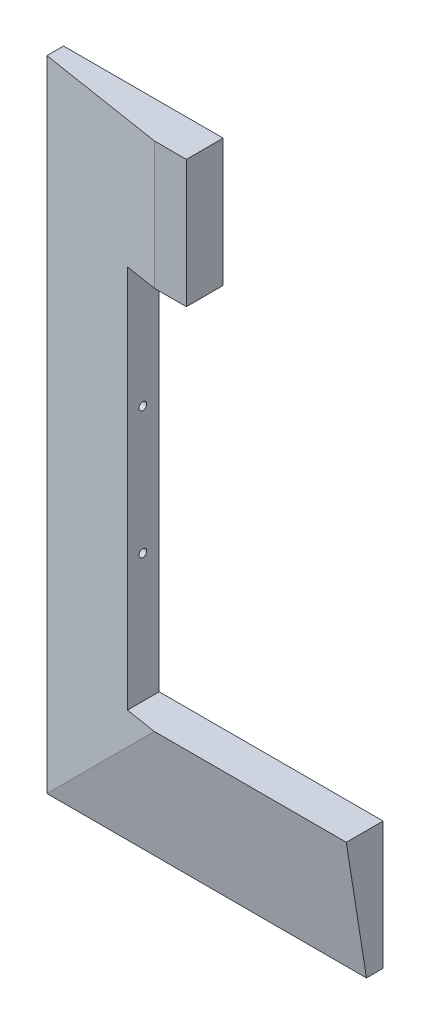
ISO-10303-21;
HEADER;
FILE_DESCRIPTION(('STEP AP214'),'2;1');
FILE_NAME('part.step','',(''),(''),'','','');
FILE_SCHEMA(('AUTOMOTIVE_DESIGN { 1 0 10303 214 1 1 1 1 }'));
ENDSEC;
DATA;
#1=APPLICATION_CONTEXT('core data for automotive mechanical design processes');
#2=APPLICATION_PROTOCOL_DEFINITION('international standard','automotive_design',2000,#1);
#3=PRODUCT_CONTEXT('',#1,'mechanical');
#4=PRODUCT('Part','Part','',(#3));
#5=PRODUCT_RELATED_PRODUCT_CATEGORY('part','',(#4));
#6=PRODUCT_DEFINITION_FORMATION('','',#4);
#7=PRODUCT_DEFINITION_CONTEXT('part definition',#1,'design');
#8=PRODUCT_DEFINITION('design','',#6,#7);
#9=PRODUCT_DEFINITION_SHAPE('','',#8);
#10=(LENGTH_UNIT() NAMED_UNIT(*) SI_UNIT(.MILLI.,.METRE.));
#11=(NAMED_UNIT(*) PLANE_ANGLE_UNIT() SI_UNIT($,.RADIAN.));
#12=(NAMED_UNIT(*) SI_UNIT($,.STERADIAN.) SOLID_ANGLE_UNIT());
#13=UNCERTAINTY_MEASURE_WITH_UNIT(LENGTH_MEASURE(1.E-05),#10,'distance_accuracy_value','');
#14=(GEOMETRIC_REPRESENTATION_CONTEXT(3) GLOBAL_UNCERTAINTY_ASSIGNED_CONTEXT((#13)) GLOBAL_UNIT_ASSIGNED_CONTEXT((#10,
#11,#12)) REPRESENTATION_CONTEXT('',''));
#15=CARTESIAN_POINT('',(0.,0.,0.));
#16=DIRECTION('',(0.,0.,1.));
#17=DIRECTION('',(1.,0.,0.));
#18=AXIS2_PLACEMENT_3D('',#15,#16,#17);
#19=CARTESIAN_POINT('',(18.5428324180509,83.245366469038,5.2));
#20=DIRECTION('',(-1.,0.,0.));
#21=DIRECTION('',(0.,-1.,0.));
#22=AXIS2_PLACEMENT_3D('',#19,#20,#21);
#23=PLANE('',#22);
#24=DIRECTION('',(0.,0.,-1.));
#25=VECTOR('',#24,1.);
#26=CARTESIAN_POINT('',(18.5428324180509,-76.654633530962,5.2));
#27=LINE('',#26,#25);
#28=CARTESIAN_POINT('',(18.5428324180509,-76.654633530962,11.5));
#29=VERTEX_POINT('',#28);
#30=CARTESIAN_POINT('',(18.5428324180509,-76.654633530962,0.));
#31=VERTEX_POINT('',#30);
#32=EDGE_CURVE('E412',#29,#31,#27,.T.);
#33=ORIENTED_EDGE('',*,*,#32,.F.);
#34=DIRECTION('',(0.,-0.987762965329069,-0.155962573473011));
#35=VECTOR('',#34,1.);
#36=CARTESIAN_POINT('',(18.5428324180509,-76.654633530962,11.5));
#37=LINE('',#36,#35);
#38=CARTESIAN_POINT('',(18.5428324180509,-116.554633530962,5.2));
#39=VERTEX_POINT('',#38);
#40=EDGE_CURVE('E309',#29,#39,#37,.T.);
#41=ORIENTED_EDGE('',*,*,#40,.T.);
#42=DIRECTION('',(0.,0.,-1.));
#43=VECTOR('',#42,1.);
#44=CARTESIAN_POINT('',(18.5428324180509,-116.554633530962,5.2));
#45=LINE('',#44,#43);
#46=CARTESIAN_POINT('',(18.5428324180509,-116.554633530962,0.));
#47=VERTEX_POINT('',#46);
#48=EDGE_CURVE('E421',#39,#47,#45,.T.);
#49=ORIENTED_EDGE('',*,*,#48,.T.);
#50=DIRECTION('',(0.,1.,0.));
#51=VECTOR('',#50,1.);
#52=CARTESIAN_POINT('',(18.5428324180509,-76.654633530962,0.));
#53=LINE('',#52,#51);
#54=EDGE_CURVE('E417',#47,#31,#53,.T.);
#55=ORIENTED_EDGE('',*,*,#54,.T.);
#56=EDGE_LOOP('',(#33,#41,#49,#55));
#57=FACE_BOUND('',#56,.T.);
#58=ADVANCED_FACE('F55',(#57),#23,.F.);
#59=CARTESIAN_POINT('',(0.,0.,11.5));
#60=DIRECTION('',(0.,0.,-1.));
#61=DIRECTION('',(-1.,0.,0.));
#62=AXIS2_PLACEMENT_3D('',#59,#60,#61);
#63=PLANE('',#62);
#64=DIRECTION('',(-1.,0.,0.));
#65=VECTOR('',#64,1.);
#66=CARTESIAN_POINT('',(0.,43.345366469038,11.5));
#67=LINE('',#66,#65);
#68=CARTESIAN_POINT('',(-31.4571675819491,43.345366469038,11.5));
#69=VERTEX_POINT('',#68);
#70=CARTESIAN_POINT('',(-41.4571675819491,43.3453664690379,11.5));
#71=VERTEX_POINT('',#70);
#72=EDGE_CURVE('E216',#69,#71,#67,.T.);
#73=ORIENTED_EDGE('',*,*,#72,.F.);
#74=DIRECTION('',(0.,-1.,0.));
#75=VECTOR('',#74,1.);
#76=CARTESIAN_POINT('',(-31.4571675819491,83.245366469038,11.5));
#77=LINE('',#76,#75);
#78=CARTESIAN_POINT('',(-31.4571675819491,83.245366469038,11.5));
#79=VERTEX_POINT('',#78);
#80=EDGE_CURVE('E203',#79,#69,#77,.T.);
#81=ORIENTED_EDGE('',*,*,#80,.F.);
#82=DIRECTION('',(-1.,0.,0.));
#83=VECTOR('',#82,1.);
#84=CARTESIAN_POINT('',(-41.4571675819491,83.245366469038,11.5));
#85=LINE('',#84,#83);
#86=CARTESIAN_POINT('',(-41.4571675819491,83.245366469038,11.5));
#87=VERTEX_POINT('',#86);
#88=EDGE_CURVE('E59',#79,#87,#85,.T.);
#89=ORIENTED_EDGE('',*,*,#88,.T.);
#90=DIRECTION('',(0.,-1.,0.));
#91=VECTOR('',#90,1.);
#92=CARTESIAN_POINT('',(-41.4571675819491,-76.654633530962,11.5));
#93=LINE('',#92,#91);
#94=EDGE_CURVE('E226',#87,#71,#93,.T.);
#95=ORIENTED_EDGE('',*,*,#94,.T.);
#96=EDGE_LOOP('',(#73,#81,#89,#95));
#97=FACE_BOUND('',#96,.T.);
#98=ADVANCED_FACE('F224',(#97),#63,.F.);
#99=CARTESIAN_POINT('',(-2.78003921145281,0.,17.6069150058678));
#100=DIRECTION('',(-0.155962573473011,0.,0.987762965329069));
#101=DIRECTION('',(0.987762965329069,0.,0.155962573473011));
#102=AXIS2_PLACEMENT_3D('',#99,#100,#101);
#103=PLANE('',#102);
#104=DIRECTION('',(0.,-1.,0.));
#105=VECTOR('',#104,1.);
#106=CARTESIAN_POINT('',(-51.4571675819491,0.,9.92105263157894));
#107=LINE('',#106,#105);
#108=CARTESIAN_POINT('',(-51.4571675819491,43.3453664690379,9.92105263157894));
#109=VERTEX_POINT('',#108);
#110=CARTESIAN_POINT('',(-51.4571675819491,-76.654633530962,9.92105263157894));
#111=VERTEX_POINT('',#110);
#112=EDGE_CURVE('E284',#109,#111,#107,.T.);
#113=ORIENTED_EDGE('',*,*,#112,.F.);
#114=DIRECTION('',(0.987762965329069,0.,0.155962573473011));
#115=VECTOR('',#114,1.);
#116=CARTESIAN_POINT('',(-2.78003921145282,43.345366469038,17.6069150058678));
#117=LINE('',#116,#115);
#118=EDGE_CURVE('E298',#109,#71,#117,.T.);
#119=ORIENTED_EDGE('',*,*,#118,.T.);
#120=ORIENTED_EDGE('',*,*,#94,.F.);
#121=DIRECTION('',(-0.987762965329069,0.,-0.155962573473011));
#122=VECTOR('',#121,1.);
#123=CARTESIAN_POINT('',(-41.4571675819491,83.245366469038,11.5));
#124=LINE('',#123,#122);
#125=CARTESIAN_POINT('',(-81.3571675819492,83.245366469038,5.2));
#126=VERTEX_POINT('',#125);
#127=EDGE_CURVE('E254',#87,#126,#124,.T.);
#128=ORIENTED_EDGE('',*,*,#127,.T.);
#129=DIRECTION('',(0.,1.,0.));
#130=VECTOR('',#129,1.);
#131=CARTESIAN_POINT('',(-81.3571675819491,0.,5.2));
#132=LINE('',#131,#130);
#133=CARTESIAN_POINT('',(-81.3571675819491,-116.554633530962,5.2));
#134=VERTEX_POINT('',#133);
#135=EDGE_CURVE('E466',#126,#134,#132,.F.);
#136=ORIENTED_EDGE('',*,*,#135,.T.);
#137=DIRECTION('',(-0.702740385382544,-0.702740385382543,-0.110959008218296));
#138=VECTOR('',#137,1.);
#139=CARTESIAN_POINT('',(-41.4571675819491,-76.654633530962,11.5));
#140=LINE('',#139,#138);
#141=CARTESIAN_POINT('',(-41.4571675819491,-76.654633530962,11.5));
#142=VERTEX_POINT('',#141);
#143=EDGE_CURVE('E433',#142,#134,#140,.T.);
#144=ORIENTED_EDGE('',*,*,#143,.F.);
#145=DIRECTION('',(-0.987762965329069,0.,-0.155962573473011));
#146=VECTOR('',#145,1.);
#147=CARTESIAN_POINT('',(-2.78003921145279,-76.654633530962,17.6069150058678));
#148=LINE('',#147,#146);
#149=EDGE_CURVE('E293',#142,#111,#148,.T.);
#150=ORIENTED_EDGE('',*,*,#149,.T.);
#151=EDGE_LOOP('',(#113,#119,#120,#128,#136,#144,#150));
#152=FACE_BOUND('',#151,.T.);
#153=ADVANCED_FACE('F256',(#152),#103,.T.);
#154=CARTESIAN_POINT('',(-81.3571675819492,83.245366469038,5.2));
#155=DIRECTION('',(1.,0.,0.));
#156=DIRECTION('',(0.,1.,0.));
#157=AXIS2_PLACEMENT_3D('',#154,#155,#156);
#158=PLANE('',#157);
#159=DIRECTION('',(0.,-1.,0.));
#160=VECTOR('',#159,1.);
#161=CARTESIAN_POINT('',(-81.3571675819492,83.245366469038,0.));
#162=LINE('',#161,#160);
#163=CARTESIAN_POINT('',(-81.3571675819492,83.245366469038,0.));
#164=VERTEX_POINT('',#163);
#165=CARTESIAN_POINT('',(-81.3571675819491,-116.554633530962,0.));
#166=VERTEX_POINT('',#165);
#167=EDGE_CURVE('E440',#164,#166,#162,.T.);
#168=ORIENTED_EDGE('',*,*,#167,.T.);
#169=DIRECTION('',(0.,0.,-1.));
#170=VECTOR('',#169,1.);
#171=CARTESIAN_POINT('',(-81.3571675819491,-116.554633530962,5.2));
#172=LINE('',#171,#170);
#173=EDGE_CURVE('E294',#134,#166,#172,.T.);
#174=ORIENTED_EDGE('',*,*,#173,.F.);
#175=ORIENTED_EDGE('',*,*,#135,.F.);
#176=DIRECTION('',(0.,0.,-1.));
#177=VECTOR('',#176,1.);
#178=CARTESIAN_POINT('',(-81.3571675819492,83.245366469038,5.2));
#179=LINE('',#178,#177);
#180=EDGE_CURVE('E470',#126,#164,#179,.T.);
#181=ORIENTED_EDGE('',*,*,#180,.T.);
#182=EDGE_LOOP('',(#168,#174,#175,#181));
#183=FACE_BOUND('',#182,.T.);
#184=ADVANCED_FACE('F57',(#183),#158,.F.);
#185=CARTESIAN_POINT('',(-81.3571675819491,-116.554633530962,5.2));
#186=DIRECTION('',(0.,1.,0.));
#187=DIRECTION('',(-1.,0.,0.));
#188=AXIS2_PLACEMENT_3D('',#185,#186,#187);
#189=PLANE('',#188);
#190=DIRECTION('',(1.,0.,0.));
#191=VECTOR('',#190,1.);
#192=CARTESIAN_POINT('',(-81.3571675819491,-116.554633530962,0.));
#193=LINE('',#192,#191);
#194=EDGE_CURVE('E445',#166,#47,#193,.T.);
#195=ORIENTED_EDGE('',*,*,#194,.T.);
#196=ORIENTED_EDGE('',*,*,#48,.F.);
#197=DIRECTION('',(1.,0.,0.));
#198=VECTOR('',#197,1.);
#199=CARTESIAN_POINT('',(0.,-116.554633530962,5.2));
#200=LINE('',#199,#198);
#201=EDGE_CURVE('E431',#134,#39,#200,.T.);
#202=ORIENTED_EDGE('',*,*,#201,.F.);
#203=ORIENTED_EDGE('',*,*,#173,.T.);
#204=EDGE_LOOP('',(#195,#196,#202,#203));
#205=FACE_BOUND('',#204,.T.);
#206=ADVANCED_FACE('F494',(#205),#189,.F.);
#207=CARTESIAN_POINT('',(-51.4571675819491,-76.654633530962,5.2));
#208=DIRECTION('',(0.,-1.,0.));
#209=DIRECTION('',(1.,0.,0.));
#210=AXIS2_PLACEMENT_3D('',#207,#208,#209);
#211=PLANE('',#210);
#212=DIRECTION('',(-1.,0.,0.));
#213=VECTOR('',#212,1.);
#214=CARTESIAN_POINT('',(-51.4571675819491,-76.654633530962,0.));
#215=LINE('',#214,#213);
#216=CARTESIAN_POINT('',(-51.4571675819491,-76.654633530962,0.));
#217=VERTEX_POINT('',#216);
#218=EDGE_CURVE('E455',#31,#217,#215,.T.);
#219=ORIENTED_EDGE('',*,*,#218,.T.);
#220=DIRECTION('',(0.,0.,-1.));
#221=VECTOR('',#220,1.);
#222=CARTESIAN_POINT('',(-51.4571675819491,-76.654633530962,5.2));
#223=LINE('',#222,#221);
#224=EDGE_CURVE('E422',#111,#217,#223,.T.);
#225=ORIENTED_EDGE('',*,*,#224,.F.);
#226=ORIENTED_EDGE('',*,*,#149,.F.);
#227=DIRECTION('',(1.,0.,0.));
#228=VECTOR('',#227,1.);
#229=CARTESIAN_POINT('',(-41.4571675819491,-76.654633530962,11.5));
#230=LINE('',#229,#228);
#231=EDGE_CURVE('E233',#142,#29,#230,.T.);
#232=ORIENTED_EDGE('',*,*,#231,.T.);
#233=ORIENTED_EDGE('',*,*,#32,.T.);
#234=EDGE_LOOP('',(#219,#225,#226,#232,#233));
#235=FACE_BOUND('',#234,.T.);
#236=ADVANCED_FACE('F425',(#235),#211,.F.);
#237=CARTESIAN_POINT('',(-51.4571675819491,43.345366469038,5.2));
#238=DIRECTION('',(-1.,0.,0.));
#239=DIRECTION('',(0.,-1.,0.));
#240=AXIS2_PLACEMENT_3D('',#237,#238,#239);
#241=PLANE('',#240);
#242=DIRECTION('',(0.,1.,0.));
#243=VECTOR('',#242,1.);
#244=CARTESIAN_POINT('',(-51.4571675819491,43.345366469038,0.));
#245=LINE('',#244,#243);
#246=CARTESIAN_POINT('',(-51.4571675819491,43.345366469038,0.));
#247=VERTEX_POINT('',#246);
#248=EDGE_CURVE('E458',#217,#247,#245,.T.);
#249=ORIENTED_EDGE('',*,*,#248,.T.);
#250=DIRECTION('',(0.,0.,-1.));
#251=VECTOR('',#250,1.);
#252=CARTESIAN_POINT('',(-51.4571675819491,43.345366469038,5.2));
#253=LINE('',#252,#251);
#254=EDGE_CURVE('E467',#109,#247,#253,.T.);
#255=ORIENTED_EDGE('',*,*,#254,.F.);
#256=ORIENTED_EDGE('',*,*,#112,.T.);
#257=ORIENTED_EDGE('',*,*,#224,.T.);
#258=EDGE_LOOP('',(#249,#255,#256,#257));
#259=FACE_BOUND('',#258,.T.);
#260=CARTESIAN_POINT('',(-51.4571675819491,3.24536646903796,5.12));
#261=DIRECTION('',(1.,0.,0.));
#262=DIRECTION('',(0.,1.,0.));
#263=AXIS2_PLACEMENT_3D('',#260,#261,#262);
#264=CIRCLE('',#263,1.2);
#265=CARTESIAN_POINT('',(-51.4571675819491,4.44536646903796,5.12));
#266=VERTEX_POINT('',#265);
#267=EDGE_CURVE('E529',#266,#266,#264,.T.);
#268=ORIENTED_EDGE('',*,*,#267,.F.);
#269=EDGE_LOOP('',(#268));
#270=FACE_BOUND('',#269,.T.);
#271=CARTESIAN_POINT('',(-51.4571675819491,-36.554633530962,5.12));
#272=DIRECTION('',(1.,0.,0.));
#273=DIRECTION('',(0.,1.,0.));
#274=AXIS2_PLACEMENT_3D('',#271,#272,#273);
#275=CIRCLE('',#274,1.2);
#276=CARTESIAN_POINT('',(-51.4571675819491,-35.354633530962,5.12));
#277=VERTEX_POINT('',#276);
#278=EDGE_CURVE('E504',#277,#277,#275,.T.);
#279=ORIENTED_EDGE('',*,*,#278,.F.);
#280=EDGE_LOOP('',(#279));
#281=FACE_BOUND('',#280,.T.);
#282=ADVANCED_FACE('F498',(#259,#270,#281),#241,.F.);
#283=CARTESIAN_POINT('',(-51.4571675819491,43.345366469038,5.2));
#284=DIRECTION('',(0.,1.,0.));
#285=DIRECTION('',(0.,0.,1.));
#286=AXIS2_PLACEMENT_3D('',#283,#284,#285);
#287=PLANE('',#286);
#288=DIRECTION('',(1.,0.,0.));
#289=VECTOR('',#288,1.);
#290=CARTESIAN_POINT('',(-51.4571675819491,43.345366469038,0.));
#291=LINE('',#290,#289);
#292=CARTESIAN_POINT('',(-31.4571675819491,43.345366469038,0.));
#293=VERTEX_POINT('',#292);
#294=EDGE_CURVE('E220',#247,#293,#291,.T.);
#295=ORIENTED_EDGE('',*,*,#294,.T.);
#296=DIRECTION('',(0.,0.,1.));
#297=VECTOR('',#296,1.);
#298=CARTESIAN_POINT('',(-31.4571675819491,43.345366469038,-12.5));
#299=LINE('',#298,#297);
#300=EDGE_CURVE('E74',#293,#69,#299,.T.);
#301=ORIENTED_EDGE('',*,*,#300,.T.);
#302=ORIENTED_EDGE('',*,*,#72,.T.);
#303=ORIENTED_EDGE('',*,*,#118,.F.);
#304=ORIENTED_EDGE('',*,*,#254,.T.);
#305=EDGE_LOOP('',(#295,#301,#302,#303,#304));
#306=FACE_BOUND('',#305,.T.);
#307=ADVANCED_FACE('F214',(#306),#287,.F.);
#308=CARTESIAN_POINT('',(-81.3571675819492,83.245366469038,5.2));
#309=DIRECTION('',(0.,-1.,0.));
#310=DIRECTION('',(1.,0.,0.));
#311=AXIS2_PLACEMENT_3D('',#308,#309,#310);
#312=PLANE('',#311);
#313=ORIENTED_EDGE('',*,*,#88,.F.);
#314=DIRECTION('',(0.,0.,1.));
#315=VECTOR('',#314,1.);
#316=CARTESIAN_POINT('',(-31.4571675819491,83.245366469038,-12.5));
#317=LINE('',#316,#315);
#318=CARTESIAN_POINT('',(-31.4571675819491,83.245366469038,0.));
#319=VERTEX_POINT('',#318);
#320=EDGE_CURVE('E206',#319,#79,#317,.T.);
#321=ORIENTED_EDGE('',*,*,#320,.F.);
#322=DIRECTION('',(-1.,0.,0.));
#323=VECTOR('',#322,1.);
#324=CARTESIAN_POINT('',(-81.3571675819492,83.245366469038,0.));
#325=LINE('',#324,#323);
#326=EDGE_CURVE('E463',#319,#164,#325,.T.);
#327=ORIENTED_EDGE('',*,*,#326,.T.);
#328=ORIENTED_EDGE('',*,*,#180,.F.);
#329=ORIENTED_EDGE('',*,*,#127,.F.);
#330=EDGE_LOOP('',(#313,#321,#327,#328,#329));
#331=FACE_BOUND('',#330,.T.);
#332=ADVANCED_FACE('F271',(#331),#312,.F.);
#333=CARTESIAN_POINT('',(0.,0.,0.));
#334=DIRECTION('',(0.,0.,1.));
#335=DIRECTION('',(1.,0.,0.));
#336=AXIS2_PLACEMENT_3D('',#333,#334,#335);
#337=PLANE('',#336);
#338=ORIENTED_EDGE('',*,*,#326,.F.);
#339=DIRECTION('',(0.,-1.,0.));
#340=VECTOR('',#339,1.);
#341=CARTESIAN_POINT('',(-31.4571675819491,0.,0.));
#342=LINE('',#341,#340);
#343=EDGE_CURVE('E12',#319,#293,#342,.T.);
#344=ORIENTED_EDGE('',*,*,#343,.T.);
#345=ORIENTED_EDGE('',*,*,#294,.F.);
#346=ORIENTED_EDGE('',*,*,#248,.F.);
#347=ORIENTED_EDGE('',*,*,#218,.F.);
#348=ORIENTED_EDGE('',*,*,#54,.F.);
#349=ORIENTED_EDGE('',*,*,#194,.F.);
#350=ORIENTED_EDGE('',*,*,#167,.F.);
#351=EDGE_LOOP('',(#338,#344,#345,#346,#347,#348,#349,#350));
#352=FACE_BOUND('',#351,.T.);
#353=ADVANCED_FACE('F268',(#352),#337,.F.);
#354=CARTESIAN_POINT('',(0.,-3.63619378859097,23.0292273277428));
#355=DIRECTION('',(0.,-0.155962573473011,0.987762965329069));
#356=DIRECTION('',(0.,-0.987762965329069,-0.155962573473011));
#357=AXIS2_PLACEMENT_3D('',#354,#355,#356);
#358=PLANE('',#357);
#359=ORIENTED_EDGE('',*,*,#143,.T.);
#360=ORIENTED_EDGE('',*,*,#201,.T.);
#361=ORIENTED_EDGE('',*,*,#40,.F.);
#362=ORIENTED_EDGE('',*,*,#231,.F.);
#363=EDGE_LOOP('',(#359,#360,#361,#362));
#364=FACE_BOUND('',#363,.T.);
#365=ADVANCED_FACE('F266',(#364),#358,.T.);
#366=CARTESIAN_POINT('',(-55.2571675819491,3.24536646903796,5.12));
#367=DIRECTION('',(1.,0.,0.));
#368=DIRECTION('',(0.,1.,0.));
#369=AXIS2_PLACEMENT_3D('',#366,#367,#368);
#370=PLANE('',#369);
#371=CARTESIAN_POINT('',(-55.2571675819491,3.24536646903796,5.12));
#372=DIRECTION('',(1.,0.,0.));
#373=DIRECTION('',(0.,1.,0.));
#374=AXIS2_PLACEMENT_3D('',#371,#372,#373);
#375=CIRCLE('',#374,1.2);
#376=CARTESIAN_POINT('',(-55.2571675819491,4.44536646903796,5.12));
#377=VERTEX_POINT('',#376);
#378=EDGE_CURVE('E530',#377,#377,#375,.T.);
#379=ORIENTED_EDGE('',*,*,#378,.T.);
#380=EDGE_LOOP('',(#379));
#381=FACE_BOUND('',#380,.T.);
#382=DIRECTION('',(0.,0.5,-0.866025403784438));
#383=VECTOR('',#382,1.);
#384=CARTESIAN_POINT('',(-55.2571675819491,5.67023759963439,5.12));
#385=LINE('',#384,#383);
#386=CARTESIAN_POINT('',(-55.2571675819491,4.45780203433617,7.22));
#387=VERTEX_POINT('',#386);
#388=CARTESIAN_POINT('',(-55.2571675819491,5.67023759963439,5.12));
#389=VERTEX_POINT('',#388);
#390=EDGE_CURVE('E303',#387,#389,#385,.T.);
#391=ORIENTED_EDGE('',*,*,#390,.T.);
#392=DIRECTION('',(0.,-0.5,-0.866025403784439));
#393=VECTOR('',#392,1.);
#394=CARTESIAN_POINT('',(-55.2571675819491,4.45780203433618,3.02));
#395=LINE('',#394,#393);
#396=CARTESIAN_POINT('',(-55.2571675819491,4.45780203433618,3.02));
#397=VERTEX_POINT('',#396);
#398=EDGE_CURVE('E553',#389,#397,#395,.T.);
#399=ORIENTED_EDGE('',*,*,#398,.T.);
#400=DIRECTION('',(0.,-1.,0.));
#401=VECTOR('',#400,1.);
#402=CARTESIAN_POINT('',(-55.2571675819491,2.03293090373974,3.02));
#403=LINE('',#402,#401);
#404=CARTESIAN_POINT('',(-55.2571675819491,2.03293090373974,3.02));
#405=VERTEX_POINT('',#404);
#406=EDGE_CURVE('E549',#397,#405,#403,.T.);
#407=ORIENTED_EDGE('',*,*,#406,.T.);
#408=DIRECTION('',(0.,-0.5,0.866025403784439));
#409=VECTOR('',#408,1.);
#410=CARTESIAN_POINT('',(-55.2571675819491,0.82049533844153,5.12));
#411=LINE('',#410,#409);
#412=CARTESIAN_POINT('',(-55.2571675819491,0.82049533844153,5.12));
#413=VERTEX_POINT('',#412);
#414=EDGE_CURVE('E545',#405,#413,#411,.T.);
#415=ORIENTED_EDGE('',*,*,#414,.T.);
#416=DIRECTION('',(0.,0.5,0.866025403784439));
#417=VECTOR('',#416,1.);
#418=CARTESIAN_POINT('',(-55.2571675819491,2.03293090373975,7.22));
#419=LINE('',#418,#417);
#420=CARTESIAN_POINT('',(-55.2571675819491,2.03293090373975,7.22));
#421=VERTEX_POINT('',#420);
#422=EDGE_CURVE('E541',#413,#421,#419,.T.);
#423=ORIENTED_EDGE('',*,*,#422,.T.);
#424=DIRECTION('',(0.,1.,0.));
#425=VECTOR('',#424,1.);
#426=CARTESIAN_POINT('',(-55.2571675819491,4.45780203433617,7.22));
#427=LINE('',#426,#425);
#428=EDGE_CURVE('E534',#421,#387,#427,.T.);
#429=ORIENTED_EDGE('',*,*,#428,.T.);
#430=EDGE_LOOP('',(#391,#399,#407,#415,#423,#429));
#431=FACE_BOUND('',#430,.T.);
#432=ADVANCED_FACE('F390',(#381,#431),#370,.F.);
#433=CARTESIAN_POINT('',(-55.2571675819491,3.24536646903796,5.12));
#434=DIRECTION('',(1.,0.,0.));
#435=DIRECTION('',(0.,1.,0.));
#436=AXIS2_PLACEMENT_3D('',#433,#434,#435);
#437=CYLINDRICAL_SURFACE('',#436,1.2);
#438=CARTESIAN_POINT('',(-55.2571675819491,4.44536646903796,5.12));
#439=CARTESIAN_POINT('',(-55.2175842486158,4.44536646903796,5.12));
#440=CARTESIAN_POINT('',(-55.1780009152825,4.44536646903796,5.12));
#441=CARTESIAN_POINT('',(-55.0988342486158,4.44536646903796,5.12));
#442=CARTESIAN_POINT('',(-55.0592509152825,4.44536646903796,5.12));
#443=CARTESIAN_POINT('',(-54.9800842486158,4.44536646903796,5.12));
#444=CARTESIAN_POINT('',(-54.9405009152825,4.44536646903796,5.12));
#445=CARTESIAN_POINT('',(-54.8613342486158,4.44536646903796,5.12));
#446=CARTESIAN_POINT('',(-54.8217509152825,4.44536646903796,5.12));
#447=CARTESIAN_POINT('',(-54.7425842486158,4.44536646903796,5.12));
#448=CARTESIAN_POINT('',(-54.7030009152825,4.44536646903796,5.12));
#449=CARTESIAN_POINT('',(-54.6238342486158,4.44536646903796,5.12));
#450=CARTESIAN_POINT('',(-54.5842509152825,4.44536646903796,5.12));
#451=CARTESIAN_POINT('',(-54.5050842486158,4.44536646903796,5.12));
#452=CARTESIAN_POINT('',(-54.4655009152825,4.44536646903796,5.12));
#453=CARTESIAN_POINT('',(-54.3863342486158,4.44536646903796,5.12));
#454=CARTESIAN_POINT('',(-54.3467509152825,4.44536646903796,5.12));
#455=CARTESIAN_POINT('',(-54.2675842486158,4.44536646903796,5.12));
#456=CARTESIAN_POINT('',(-54.2280009152825,4.44536646903796,5.12));
#457=CARTESIAN_POINT('',(-54.1488342486158,4.44536646903796,5.12));
#458=CARTESIAN_POINT('',(-54.1092509152825,4.44536646903796,5.12));
#459=CARTESIAN_POINT('',(-54.0300842486158,4.44536646903796,5.12));
#460=CARTESIAN_POINT('',(-53.9905009152825,4.44536646903796,5.12));
#461=CARTESIAN_POINT('',(-53.9113342486158,4.44536646903796,5.12));
#462=CARTESIAN_POINT('',(-53.8717509152825,4.44536646903796,5.12));
#463=CARTESIAN_POINT('',(-53.7925842486158,4.44536646903796,5.12));
#464=CARTESIAN_POINT('',(-53.7530009152825,4.44536646903796,5.12));
#465=CARTESIAN_POINT('',(-53.6738342486158,4.44536646903796,5.12));
#466=CARTESIAN_POINT('',(-53.6342509152825,4.44536646903796,5.12));
#467=CARTESIAN_POINT('',(-53.5550842486158,4.44536646903796,5.12));
#468=CARTESIAN_POINT('',(-53.5155009152825,4.44536646903796,5.12));
#469=CARTESIAN_POINT('',(-53.4363342486158,4.44536646903796,5.12));
#470=CARTESIAN_POINT('',(-53.3967509152825,4.44536646903796,5.12));
#471=CARTESIAN_POINT('',(-53.3175842486158,4.44536646903796,5.12));
#472=CARTESIAN_POINT('',(-53.2780009152825,4.44536646903796,5.12));
#473=CARTESIAN_POINT('',(-53.1988342486158,4.44536646903796,5.12));
#474=CARTESIAN_POINT('',(-53.1592509152825,4.44536646903796,5.12));
#475=CARTESIAN_POINT('',(-53.0800842486158,4.44536646903796,5.12));
#476=CARTESIAN_POINT('',(-53.0405009152825,4.44536646903796,5.12));
#477=CARTESIAN_POINT('',(-52.9613342486158,4.44536646903796,5.12));
#478=CARTESIAN_POINT('',(-52.9217509152825,4.44536646903796,5.12));
#479=CARTESIAN_POINT('',(-52.8425842486158,4.44536646903796,5.12));
#480=CARTESIAN_POINT('',(-52.8030009152825,4.44536646903796,5.12));
#481=CARTESIAN_POINT('',(-52.7238342486158,4.44536646903796,5.12));
#482=CARTESIAN_POINT('',(-52.6842509152825,4.44536646903796,5.12));
#483=CARTESIAN_POINT('',(-52.6050842486158,4.44536646903796,5.12));
#484=CARTESIAN_POINT('',(-52.5655009152825,4.44536646903796,5.12));
#485=CARTESIAN_POINT('',(-52.4863342486158,4.44536646903796,5.12));
#486=CARTESIAN_POINT('',(-52.4467509152825,4.44536646903796,5.12));
#487=CARTESIAN_POINT('',(-52.3675842486158,4.44536646903796,5.12));
#488=CARTESIAN_POINT('',(-52.3280009152825,4.44536646903796,5.12));
#489=CARTESIAN_POINT('',(-52.2488342486158,4.44536646903796,5.12));
#490=CARTESIAN_POINT('',(-52.2092509152825,4.44536646903796,5.12));
#491=CARTESIAN_POINT('',(-52.1300842486158,4.44536646903796,5.12));
#492=CARTESIAN_POINT('',(-52.0905009152825,4.44536646903796,5.12));
#493=CARTESIAN_POINT('',(-52.0113342486158,4.44536646903796,5.12));
#494=CARTESIAN_POINT('',(-51.9717509152825,4.44536646903796,5.12));
#495=CARTESIAN_POINT('',(-51.8925842486158,4.44536646903796,5.12));
#496=CARTESIAN_POINT('',(-51.8530009152825,4.44536646903796,5.12));
#497=CARTESIAN_POINT('',(-51.7738342486158,4.44536646903796,5.12));
#498=CARTESIAN_POINT('',(-51.7342509152825,4.44536646903796,5.12));
#499=CARTESIAN_POINT('',(-51.6550842486158,4.44536646903796,5.12));
#500=CARTESIAN_POINT('',(-51.6155009152825,4.44536646903796,5.12));
#501=CARTESIAN_POINT('',(-51.5363342486158,4.44536646903796,5.12));
#502=CARTESIAN_POINT('',(-51.4967509152825,4.44536646903796,5.12));
#503=CARTESIAN_POINT('',(-51.4571675819491,4.44536646903796,5.12));
#504=B_SPLINE_CURVE_WITH_KNOTS('',3,(#438,#439,#440,#441,#442,#443,#444,#445,#446,#447,#448,
#449,#450,#451,#452,#453,#454,#455,#456,#457,#458,#459,#460,#461,#462,#463,#464,#465,#466,#467,
#468,#469,#470,#471,#472,#473,#474,#475,#476,#477,#478,#479,#480,#481,#482,#483,#484,#485,#486,
#487,#488,#489,#490,#491,#492,#493,#494,#495,#496,#497,#498,#499,#500,#501,#502,#503),
.UNSPECIFIED.,.F.,.F.,(4,2,2,2,2,2,2,2,2,2,2,2,2,2,2,2,2,2,2,2,2,2,2,2,2,2,2,2,2,2,2,2,4),(0.,
0.118750000000001,0.237500000000002,0.356250000000002,0.475000000000003,0.593750000000004,
0.712500000000005,0.831250000000006,0.950000000000006,1.06875,1.1875,1.30625,1.425,1.54375,
1.6625,1.78125000000001,1.90000000000001,2.01875,2.1375,2.25625,2.375,2.49375,2.6125,2.73125,
2.85000000000001,2.96875,3.0875,3.20625,3.325,3.44375,3.5625,3.68125,3.8),.UNSPECIFIED.);
#505=EDGE_CURVE('BSEAM336',#377,#266,#504,.T.);
#506=ORIENTED_EDGE('',*,*,#378,.F.);
#507=ORIENTED_EDGE('',*,*,#267,.T.);
#508=ORIENTED_EDGE('',*,*,#505,.T.);
#509=ORIENTED_EDGE('',*,*,#505,.F.);
#510=EDGE_LOOP('',(#506,#508,#507,#509));
#511=FACE_BOUND('',#510,.T.);
#512=ADVANCED_FACE('F336',(#511),#437,.F.);
#513=CARTESIAN_POINT('',(-57.0571675819491,0.,0.));
#514=DIRECTION('',(1.,0.,0.));
#515=DIRECTION('',(0.,0.,-1.));
#516=AXIS2_PLACEMENT_3D('',#513,#514,#515);
#517=PLANE('',#516);
#518=DIRECTION('',(0.,0.5,0.866025403784439));
#519=VECTOR('',#518,1.);
#520=CARTESIAN_POINT('',(-57.0571675819491,4.45780203433617,3.02));
#521=LINE('',#520,#519);
#522=CARTESIAN_POINT('',(-57.0571675819491,4.45780203433617,3.02));
#523=VERTEX_POINT('',#522);
#524=CARTESIAN_POINT('',(-57.0571675819491,5.67023759963439,5.12));
#525=VERTEX_POINT('',#524);
#526=EDGE_CURVE('E245',#523,#525,#521,.T.);
#527=ORIENTED_EDGE('',*,*,#526,.T.);
#528=DIRECTION('',(0.,-0.5,0.866025403784438));
#529=VECTOR('',#528,1.);
#530=CARTESIAN_POINT('',(-57.0571675819491,5.67023759963439,5.12));
#531=LINE('',#530,#529);
#532=CARTESIAN_POINT('',(-57.0571675819491,4.45780203433617,7.22));
#533=VERTEX_POINT('',#532);
#534=EDGE_CURVE('E636',#525,#533,#531,.T.);
#535=ORIENTED_EDGE('',*,*,#534,.T.);
#536=DIRECTION('',(0.,-1.,0.));
#537=VECTOR('',#536,1.);
#538=CARTESIAN_POINT('',(-57.0571675819491,4.45780203433617,7.22));
#539=LINE('',#538,#537);
#540=CARTESIAN_POINT('',(-57.0571675819491,2.03293090373974,7.22));
#541=VERTEX_POINT('',#540);
#542=EDGE_CURVE('E633',#533,#541,#539,.T.);
#543=ORIENTED_EDGE('',*,*,#542,.T.);
#544=DIRECTION('',(0.,-0.5,-0.866025403784439));
#545=VECTOR('',#544,1.);
#546=CARTESIAN_POINT('',(-57.0571675819491,2.03293090373974,7.22));
#547=LINE('',#546,#545);
#548=CARTESIAN_POINT('',(-57.0571675819491,0.82049533844153,5.12));
#549=VERTEX_POINT('',#548);
#550=EDGE_CURVE('E629',#541,#549,#547,.T.);
#551=ORIENTED_EDGE('',*,*,#550,.T.);
#552=DIRECTION('',(0.,0.5,-0.866025403784439));
#553=VECTOR('',#552,1.);
#554=CARTESIAN_POINT('',(-57.0571675819491,0.82049533844153,5.12));
#555=LINE('',#554,#553);
#556=CARTESIAN_POINT('',(-57.0571675819491,2.03293090373974,3.02));
#557=VERTEX_POINT('',#556);
#558=EDGE_CURVE('E625',#549,#557,#555,.T.);
#559=ORIENTED_EDGE('',*,*,#558,.T.);
#560=DIRECTION('',(0.,1.,0.));
#561=VECTOR('',#560,1.);
#562=CARTESIAN_POINT('',(-57.0571675819491,2.03293090373974,3.02));
#563=LINE('',#562,#561);
#564=EDGE_CURVE('E602',#557,#523,#563,.T.);
#565=ORIENTED_EDGE('',*,*,#564,.T.);
#566=EDGE_LOOP('',(#527,#535,#543,#551,#559,#565));
#567=FACE_BOUND('',#566,.T.);
#568=ADVANCED_FACE('F331',(#567),#517,.T.);
#569=CARTESIAN_POINT('',(-57.0571675819491,5.67023759963439,5.12));
#570=DIRECTION('',(0.,0.866025403784438,0.5));
#571=DIRECTION('',(0.,-0.5,0.866025403784438));
#572=AXIS2_PLACEMENT_3D('',#569,#570,#571);
#573=PLANE('',#572);
#574=ORIENTED_EDGE('',*,*,#390,.F.);
#575=DIRECTION('',(1.,0.,0.));
#576=VECTOR('',#575,1.);
#577=CARTESIAN_POINT('',(-57.0571675819491,4.45780203433617,7.22));
#578=LINE('',#577,#576);
#579=EDGE_CURVE('E603',#533,#387,#578,.T.);
#580=ORIENTED_EDGE('',*,*,#579,.F.);
#581=ORIENTED_EDGE('',*,*,#534,.F.);
#582=DIRECTION('',(1.,0.,0.));
#583=VECTOR('',#582,1.);
#584=CARTESIAN_POINT('',(-57.0571675819491,5.67023759963439,5.12));
#585=LINE('',#584,#583);
#586=EDGE_CURVE('E599',#525,#389,#585,.T.);
#587=ORIENTED_EDGE('',*,*,#586,.T.);
#588=EDGE_LOOP('',(#574,#580,#581,#587));
#589=FACE_BOUND('',#588,.T.);
#590=ADVANCED_FACE('F335',(#589),#573,.F.);
#591=CARTESIAN_POINT('',(-57.0571675819491,4.45780203433617,7.22));
#592=DIRECTION('',(0.,0.,1.));
#593=DIRECTION('',(1.,0.,0.));
#594=AXIS2_PLACEMENT_3D('',#591,#592,#593);
#595=PLANE('',#594);
#596=ORIENTED_EDGE('',*,*,#428,.F.);
#597=DIRECTION('',(1.,0.,0.));
#598=VECTOR('',#597,1.);
#599=CARTESIAN_POINT('',(-57.0571675819491,2.03293090373974,7.22));
#600=LINE('',#599,#598);
#601=EDGE_CURVE('E607',#541,#421,#600,.T.);
#602=ORIENTED_EDGE('',*,*,#601,.F.);
#603=ORIENTED_EDGE('',*,*,#542,.F.);
#604=ORIENTED_EDGE('',*,*,#579,.T.);
#605=EDGE_LOOP('',(#596,#602,#603,#604));
#606=FACE_BOUND('',#605,.T.);
#607=ADVANCED_FACE('F350',(#606),#595,.F.);
#608=CARTESIAN_POINT('',(-57.0571675819491,2.03293090373974,7.22));
#609=DIRECTION('',(0.,-0.866025403784438,0.5));
#610=DIRECTION('',(0.,-0.5,-0.866025403784439));
#611=AXIS2_PLACEMENT_3D('',#608,#609,#610);
#612=PLANE('',#611);
#613=ORIENTED_EDGE('',*,*,#422,.F.);
#614=DIRECTION('',(1.,0.,0.));
#615=VECTOR('',#614,1.);
#616=CARTESIAN_POINT('',(-57.0571675819491,0.82049533844153,5.12));
#617=LINE('',#616,#615);
#618=EDGE_CURVE('E611',#549,#413,#617,.T.);
#619=ORIENTED_EDGE('',*,*,#618,.F.);
#620=ORIENTED_EDGE('',*,*,#550,.F.);
#621=ORIENTED_EDGE('',*,*,#601,.T.);
#622=EDGE_LOOP('',(#613,#619,#620,#621));
#623=FACE_BOUND('',#622,.T.);
#624=ADVANCED_FACE('F346',(#623),#612,.F.);
#625=CARTESIAN_POINT('',(-57.0571675819491,0.82049533844153,5.12));
#626=DIRECTION('',(0.,-0.866025403784439,-0.5));
#627=DIRECTION('',(0.,0.5,-0.866025403784439));
#628=AXIS2_PLACEMENT_3D('',#625,#626,#627);
#629=PLANE('',#628);
#630=ORIENTED_EDGE('',*,*,#414,.F.);
#631=DIRECTION('',(1.,0.,0.));
#632=VECTOR('',#631,1.);
#633=CARTESIAN_POINT('',(-57.0571675819491,2.03293090373974,3.02));
#634=LINE('',#633,#632);
#635=EDGE_CURVE('E615',#557,#405,#634,.T.);
#636=ORIENTED_EDGE('',*,*,#635,.F.);
#637=ORIENTED_EDGE('',*,*,#558,.F.);
#638=ORIENTED_EDGE('',*,*,#618,.T.);
#639=EDGE_LOOP('',(#630,#636,#637,#638));
#640=FACE_BOUND('',#639,.T.);
#641=ADVANCED_FACE('F342',(#640),#629,.F.);
#642=CARTESIAN_POINT('',(-57.0571675819491,2.03293090373974,3.02));
#643=DIRECTION('',(0.,0.,-1.));
#644=DIRECTION('',(0.,1.,0.));
#645=AXIS2_PLACEMENT_3D('',#642,#643,#644);
#646=PLANE('',#645);
#647=ORIENTED_EDGE('',*,*,#406,.F.);
#648=DIRECTION('',(1.,0.,0.));
#649=VECTOR('',#648,1.);
#650=CARTESIAN_POINT('',(-57.0571675819491,4.45780203433617,3.02));
#651=LINE('',#650,#649);
#652=EDGE_CURVE('E557',#523,#397,#651,.T.);
#653=ORIENTED_EDGE('',*,*,#652,.F.);
#654=ORIENTED_EDGE('',*,*,#564,.F.);
#655=ORIENTED_EDGE('',*,*,#635,.T.);
#656=EDGE_LOOP('',(#647,#653,#654,#655));
#657=FACE_BOUND('',#656,.T.);
#658=ADVANCED_FACE('F338',(#657),#646,.F.);
#659=CARTESIAN_POINT('',(-57.0571675819491,4.45780203433617,3.02));
#660=DIRECTION('',(0.,0.866025403784439,-0.5));
#661=DIRECTION('',(0.,0.5,0.866025403784439));
#662=AXIS2_PLACEMENT_3D('',#659,#660,#661);
#663=PLANE('',#662);
#664=ORIENTED_EDGE('',*,*,#398,.F.);
#665=ORIENTED_EDGE('',*,*,#586,.F.);
#666=ORIENTED_EDGE('',*,*,#526,.F.);
#667=ORIENTED_EDGE('',*,*,#652,.T.);
#668=EDGE_LOOP('',(#664,#665,#666,#667));
#669=FACE_BOUND('',#668,.T.);
#670=ADVANCED_FACE('F341',(#669),#663,.F.);
#671=CARTESIAN_POINT('',(-55.2571675819491,-36.554633530962,5.12));
#672=DIRECTION('',(1.,0.,0.));
#673=DIRECTION('',(0.,1.,0.));
#674=AXIS2_PLACEMENT_3D('',#671,#672,#673);
#675=PLANE('',#674);
#676=CARTESIAN_POINT('',(-55.2571675819491,-36.554633530962,5.12));
#677=DIRECTION('',(1.,0.,0.));
#678=DIRECTION('',(0.,1.,0.));
#679=AXIS2_PLACEMENT_3D('',#676,#677,#678);
#680=CIRCLE('',#679,1.2);
#681=CARTESIAN_POINT('',(-55.2571675819491,-35.354633530962,5.12));
#682=VERTEX_POINT('',#681);
#683=EDGE_CURVE('E501',#682,#682,#680,.T.);
#684=ORIENTED_EDGE('',*,*,#683,.T.);
#685=EDGE_LOOP('',(#684));
#686=FACE_BOUND('',#685,.T.);
#687=DIRECTION('',(0.,0.5,-0.866025403784439));
#688=VECTOR('',#687,1.);
#689=CARTESIAN_POINT('',(-55.2571675819491,-34.1297624003656,5.11999999999999));
#690=LINE('',#689,#688);
#691=CARTESIAN_POINT('',(-55.2571675819491,-35.3421979656638,7.22));
#692=VERTEX_POINT('',#691);
#693=CARTESIAN_POINT('',(-55.2571675819491,-34.1297624003656,5.11999999999999));
#694=VERTEX_POINT('',#693);
#695=EDGE_CURVE('E66',#692,#694,#690,.T.);
#696=ORIENTED_EDGE('',*,*,#695,.T.);
#697=DIRECTION('',(0.,-0.500000000000002,-0.866025403784438));
#698=VECTOR('',#697,1.);
#699=CARTESIAN_POINT('',(-55.2571675819491,-35.3421979656638,3.02));
#700=LINE('',#699,#698);
#701=CARTESIAN_POINT('',(-55.2571675819491,-35.3421979656638,3.02));
#702=VERTEX_POINT('',#701);
#703=EDGE_CURVE('E525',#694,#702,#700,.T.);
#704=ORIENTED_EDGE('',*,*,#703,.T.);
#705=DIRECTION('',(0.,-1.,0.));
#706=VECTOR('',#705,1.);
#707=CARTESIAN_POINT('',(-55.2571675819491,-37.7670690962603,3.02));
#708=LINE('',#707,#706);
#709=CARTESIAN_POINT('',(-55.2571675819491,-37.7670690962603,3.02));
#710=VERTEX_POINT('',#709);
#711=EDGE_CURVE('E81',#702,#710,#708,.T.);
#712=ORIENTED_EDGE('',*,*,#711,.T.);
#713=DIRECTION('',(0.,-0.500000000000002,0.866025403784438));
#714=VECTOR('',#713,1.);
#715=CARTESIAN_POINT('',(-55.2571675819491,-38.9795046615585,5.11999999999999));
#716=LINE('',#715,#714);
#717=CARTESIAN_POINT('',(-55.2571675819491,-38.9795046615585,5.11999999999999));
#718=VERTEX_POINT('',#717);
#719=EDGE_CURVE('E519',#710,#718,#716,.T.);
#720=ORIENTED_EDGE('',*,*,#719,.T.);
#721=DIRECTION('',(0.,0.5,0.866025403784439));
#722=VECTOR('',#721,1.);
#723=CARTESIAN_POINT('',(-55.2571675819491,-37.7670690962603,7.22));
#724=LINE('',#723,#722);
#725=CARTESIAN_POINT('',(-55.2571675819491,-37.7670690962603,7.22));
#726=VERTEX_POINT('',#725);
#727=EDGE_CURVE('E515',#718,#726,#724,.T.);
#728=ORIENTED_EDGE('',*,*,#727,.T.);
#729=DIRECTION('',(0.,1.,0.));
#730=VECTOR('',#729,1.);
#731=CARTESIAN_POINT('',(-55.2571675819491,-35.3421979656638,7.22));
#732=LINE('',#731,#730);
#733=EDGE_CURVE('E509',#726,#692,#732,.T.);
#734=ORIENTED_EDGE('',*,*,#733,.T.);
#735=EDGE_LOOP('',(#696,#704,#712,#720,#728,#734));
#736=FACE_BOUND('',#735,.T.);
#737=ADVANCED_FACE('F360',(#686,#736),#675,.F.);
#738=CARTESIAN_POINT('',(-55.2571675819491,-36.554633530962,5.12));
#739=DIRECTION('',(1.,0.,0.));
#740=DIRECTION('',(0.,1.,0.));
#741=AXIS2_PLACEMENT_3D('',#738,#739,#740);
#742=CYLINDRICAL_SURFACE('',#741,1.2);
#743=CARTESIAN_POINT('',(-55.2571675819491,-35.354633530962,5.12));
#744=CARTESIAN_POINT('',(-55.2175842486158,-35.354633530962,5.12));
#745=CARTESIAN_POINT('',(-55.1780009152825,-35.354633530962,5.12));
#746=CARTESIAN_POINT('',(-55.0988342486158,-35.354633530962,5.12));
#747=CARTESIAN_POINT('',(-55.0592509152825,-35.354633530962,5.12));
#748=CARTESIAN_POINT('',(-54.9800842486158,-35.354633530962,5.12));
#749=CARTESIAN_POINT('',(-54.9405009152825,-35.354633530962,5.12));
#750=CARTESIAN_POINT('',(-54.8613342486158,-35.354633530962,5.12));
#751=CARTESIAN_POINT('',(-54.8217509152825,-35.354633530962,5.12));
#752=CARTESIAN_POINT('',(-54.7425842486158,-35.354633530962,5.12));
#753=CARTESIAN_POINT('',(-54.7030009152825,-35.354633530962,5.12));
#754=CARTESIAN_POINT('',(-54.6238342486158,-35.354633530962,5.12));
#755=CARTESIAN_POINT('',(-54.5842509152825,-35.354633530962,5.12));
#756=CARTESIAN_POINT('',(-54.5050842486158,-35.354633530962,5.12));
#757=CARTESIAN_POINT('',(-54.4655009152825,-35.354633530962,5.12));
#758=CARTESIAN_POINT('',(-54.3863342486158,-35.354633530962,5.12));
#759=CARTESIAN_POINT('',(-54.3467509152825,-35.354633530962,5.12));
#760=CARTESIAN_POINT('',(-54.2675842486158,-35.354633530962,5.12));
#761=CARTESIAN_POINT('',(-54.2280009152825,-35.354633530962,5.12));
#762=CARTESIAN_POINT('',(-54.1488342486158,-35.354633530962,5.12));
#763=CARTESIAN_POINT('',(-54.1092509152825,-35.354633530962,5.12));
#764=CARTESIAN_POINT('',(-54.0300842486158,-35.354633530962,5.12));
#765=CARTESIAN_POINT('',(-53.9905009152825,-35.354633530962,5.12));
#766=CARTESIAN_POINT('',(-53.9113342486158,-35.354633530962,5.12));
#767=CARTESIAN_POINT('',(-53.8717509152825,-35.354633530962,5.12));
#768=CARTESIAN_POINT('',(-53.7925842486158,-35.354633530962,5.12));
#769=CARTESIAN_POINT('',(-53.7530009152825,-35.354633530962,5.12));
#770=CARTESIAN_POINT('',(-53.6738342486158,-35.354633530962,5.12));
#771=CARTESIAN_POINT('',(-53.6342509152825,-35.354633530962,5.12));
#772=CARTESIAN_POINT('',(-53.5550842486158,-35.354633530962,5.12));
#773=CARTESIAN_POINT('',(-53.5155009152825,-35.354633530962,5.12));
#774=CARTESIAN_POINT('',(-53.4363342486158,-35.354633530962,5.12));
#775=CARTESIAN_POINT('',(-53.3967509152825,-35.354633530962,5.12));
#776=CARTESIAN_POINT('',(-53.3175842486158,-35.354633530962,5.12));
#777=CARTESIAN_POINT('',(-53.2780009152825,-35.354633530962,5.12));
#778=CARTESIAN_POINT('',(-53.1988342486158,-35.354633530962,5.12));
#779=CARTESIAN_POINT('',(-53.1592509152825,-35.354633530962,5.12));
#780=CARTESIAN_POINT('',(-53.0800842486158,-35.354633530962,5.12));
#781=CARTESIAN_POINT('',(-53.0405009152825,-35.354633530962,5.12));
#782=CARTESIAN_POINT('',(-52.9613342486158,-35.354633530962,5.12));
#783=CARTESIAN_POINT('',(-52.9217509152825,-35.354633530962,5.12));
#784=CARTESIAN_POINT('',(-52.8425842486158,-35.354633530962,5.12));
#785=CARTESIAN_POINT('',(-52.8030009152825,-35.354633530962,5.12));
#786=CARTESIAN_POINT('',(-52.7238342486158,-35.354633530962,5.12));
#787=CARTESIAN_POINT('',(-52.6842509152825,-35.354633530962,5.12));
#788=CARTESIAN_POINT('',(-52.6050842486158,-35.354633530962,5.12));
#789=CARTESIAN_POINT('',(-52.5655009152825,-35.354633530962,5.12));
#790=CARTESIAN_POINT('',(-52.4863342486158,-35.354633530962,5.12));
#791=CARTESIAN_POINT('',(-52.4467509152825,-35.354633530962,5.12));
#792=CARTESIAN_POINT('',(-52.3675842486158,-35.354633530962,5.12));
#793=CARTESIAN_POINT('',(-52.3280009152825,-35.354633530962,5.12));
#794=CARTESIAN_POINT('',(-52.2488342486158,-35.354633530962,5.12));
#795=CARTESIAN_POINT('',(-52.2092509152825,-35.354633530962,5.12));
#796=CARTESIAN_POINT('',(-52.1300842486158,-35.354633530962,5.12));
#797=CARTESIAN_POINT('',(-52.0905009152825,-35.354633530962,5.12));
#798=CARTESIAN_POINT('',(-52.0113342486158,-35.354633530962,5.12));
#799=CARTESIAN_POINT('',(-51.9717509152825,-35.354633530962,5.12));
#800=CARTESIAN_POINT('',(-51.8925842486158,-35.354633530962,5.12));
#801=CARTESIAN_POINT('',(-51.8530009152825,-35.354633530962,5.12));
#802=CARTESIAN_POINT('',(-51.7738342486158,-35.354633530962,5.12));
#803=CARTESIAN_POINT('',(-51.7342509152825,-35.354633530962,5.12));
#804=CARTESIAN_POINT('',(-51.6550842486158,-35.354633530962,5.12));
#805=CARTESIAN_POINT('',(-51.6155009152825,-35.354633530962,5.12));
#806=CARTESIAN_POINT('',(-51.5363342486158,-35.354633530962,5.12));
#807=CARTESIAN_POINT('',(-51.4967509152825,-35.354633530962,5.12));
#808=CARTESIAN_POINT('',(-51.4571675819491,-35.354633530962,5.12));
#809=B_SPLINE_CURVE_WITH_KNOTS('',3,(#743,#744,#745,#746,#747,#748,#749,#750,#751,#752,#753,
#754,#755,#756,#757,#758,#759,#760,#761,#762,#763,#764,#765,#766,#767,#768,#769,#770,#771,#772,
#773,#774,#775,#776,#777,#778,#779,#780,#781,#782,#783,#784,#785,#786,#787,#788,#789,#790,#791,
#792,#793,#794,#795,#796,#797,#798,#799,#800,#801,#802,#803,#804,#805,#806,#807,#808),
.UNSPECIFIED.,.F.,.F.,(4,2,2,2,2,2,2,2,2,2,2,2,2,2,2,2,2,2,2,2,2,2,2,2,2,2,2,2,2,2,2,2,4),(0.,
0.118750000000001,0.237500000000002,0.356250000000002,0.475000000000003,0.593750000000004,
0.712500000000005,0.831250000000006,0.950000000000006,1.06875,1.1875,1.30625,1.425,1.54375,
1.6625,1.78125000000001,1.90000000000001,2.01875,2.1375,2.25625,2.375,2.49375,2.6125,2.73125,
2.85000000000001,2.96875,3.0875,3.20625,3.325,3.44375,3.5625,3.68125,3.8),.UNSPECIFIED.);
#810=EDGE_CURVE('BSEAM388',#682,#277,#809,.T.);
#811=ORIENTED_EDGE('',*,*,#683,.F.);
#812=ORIENTED_EDGE('',*,*,#278,.T.);
#813=ORIENTED_EDGE('',*,*,#810,.T.);
#814=ORIENTED_EDGE('',*,*,#810,.F.);
#815=EDGE_LOOP('',(#811,#813,#812,#814));
#816=FACE_BOUND('',#815,.T.);
#817=ADVANCED_FACE('F388',(#816),#742,.F.);
#818=CARTESIAN_POINT('',(-57.0571675819491,0.,0.));
#819=DIRECTION('',(1.,0.,0.));
#820=DIRECTION('',(0.,0.,-1.));
#821=AXIS2_PLACEMENT_3D('',#818,#819,#820);
#822=PLANE('',#821);
#823=DIRECTION('',(0.,0.500000000000002,0.866025403784438));
#824=VECTOR('',#823,1.);
#825=CARTESIAN_POINT('',(-57.0571675819491,-35.3421979656638,3.02));
#826=LINE('',#825,#824);
#827=CARTESIAN_POINT('',(-57.0571675819491,-35.3421979656638,3.02));
#828=VERTEX_POINT('',#827);
#829=CARTESIAN_POINT('',(-57.0571675819491,-34.1297624003656,5.11999999999999));
#830=VERTEX_POINT('',#829);
#831=EDGE_CURVE('E558',#828,#830,#826,.T.);
#832=ORIENTED_EDGE('',*,*,#831,.T.);
#833=DIRECTION('',(0.,-0.5,0.866025403784439));
#834=VECTOR('',#833,1.);
#835=CARTESIAN_POINT('',(-57.0571675819491,-34.1297624003656,5.11999999999999));
#836=LINE('',#835,#834);
#837=CARTESIAN_POINT('',(-57.0571675819491,-35.3421979656638,7.22));
#838=VERTEX_POINT('',#837);
#839=EDGE_CURVE('E562',#830,#838,#836,.T.);
#840=ORIENTED_EDGE('',*,*,#839,.T.);
#841=DIRECTION('',(0.,-1.,0.));
#842=VECTOR('',#841,1.);
#843=CARTESIAN_POINT('',(-57.0571675819491,-35.3421979656638,7.22));
#844=LINE('',#843,#842);
#845=CARTESIAN_POINT('',(-57.0571675819491,-37.7670690962603,7.22));
#846=VERTEX_POINT('',#845);
#847=EDGE_CURVE('E566',#838,#846,#844,.T.);
#848=ORIENTED_EDGE('',*,*,#847,.T.);
#849=DIRECTION('',(0.,-0.5,-0.866025403784439));
#850=VECTOR('',#849,1.);
#851=CARTESIAN_POINT('',(-57.0571675819491,-37.7670690962603,7.22));
#852=LINE('',#851,#850);
#853=CARTESIAN_POINT('',(-57.0571675819491,-38.9795046615585,5.11999999999999));
#854=VERTEX_POINT('',#853);
#855=EDGE_CURVE('E570',#846,#854,#852,.T.);
#856=ORIENTED_EDGE('',*,*,#855,.T.);
#857=DIRECTION('',(0.,0.500000000000002,-0.866025403784438));
#858=VECTOR('',#857,1.);
#859=CARTESIAN_POINT('',(-57.0571675819491,-38.9795046615585,5.11999999999999));
#860=LINE('',#859,#858);
#861=CARTESIAN_POINT('',(-57.0571675819491,-37.7670690962603,3.02));
#862=VERTEX_POINT('',#861);
#863=EDGE_CURVE('E574',#854,#862,#860,.T.);
#864=ORIENTED_EDGE('',*,*,#863,.T.);
#865=DIRECTION('',(0.,1.,0.));
#866=VECTOR('',#865,1.);
#867=CARTESIAN_POINT('',(-57.0571675819491,-37.7670690962603,3.02));
#868=LINE('',#867,#866);
#869=EDGE_CURVE('E578',#862,#828,#868,.T.);
#870=ORIENTED_EDGE('',*,*,#869,.T.);
#871=EDGE_LOOP('',(#832,#840,#848,#856,#864,#870));
#872=FACE_BOUND('',#871,.T.);
#873=ADVANCED_FACE('F371',(#872),#822,.T.);
#874=CARTESIAN_POINT('',(-57.0571675819491,-34.1297624003656,5.11999999999999));
#875=DIRECTION('',(0.,0.866025403784439,0.5));
#876=DIRECTION('',(0.,-0.5,0.866025403784439));
#877=AXIS2_PLACEMENT_3D('',#874,#875,#876);
#878=PLANE('',#877);
#879=ORIENTED_EDGE('',*,*,#695,.F.);
#880=DIRECTION('',(1.,0.,0.));
#881=VECTOR('',#880,1.);
#882=CARTESIAN_POINT('',(-57.0571675819491,-35.3421979656638,7.22));
#883=LINE('',#882,#881);
#884=EDGE_CURVE('E593',#838,#692,#883,.T.);
#885=ORIENTED_EDGE('',*,*,#884,.F.);
#886=ORIENTED_EDGE('',*,*,#839,.F.);
#887=DIRECTION('',(1.,0.,0.));
#888=VECTOR('',#887,1.);
#889=CARTESIAN_POINT('',(-57.0571675819491,-34.1297624003656,5.11999999999999));
#890=LINE('',#889,#888);
#891=EDGE_CURVE('E581',#830,#694,#890,.T.);
#892=ORIENTED_EDGE('',*,*,#891,.T.);
#893=EDGE_LOOP('',(#879,#885,#886,#892));
#894=FACE_BOUND('',#893,.T.);
#895=ADVANCED_FACE('F367',(#894),#878,.F.);
#896=CARTESIAN_POINT('',(-57.0571675819491,-35.3421979656638,7.22));
#897=DIRECTION('',(0.,0.,1.));
#898=DIRECTION('',(0.,-1.,0.));
#899=AXIS2_PLACEMENT_3D('',#896,#897,#898);
#900=PLANE('',#899);
#901=ORIENTED_EDGE('',*,*,#733,.F.);
#902=DIRECTION('',(1.,0.,0.));
#903=VECTOR('',#902,1.);
#904=CARTESIAN_POINT('',(-57.0571675819491,-37.7670690962603,7.22));
#905=LINE('',#904,#903);
#906=EDGE_CURVE('E589',#846,#726,#905,.T.);
#907=ORIENTED_EDGE('',*,*,#906,.F.);
#908=ORIENTED_EDGE('',*,*,#847,.F.);
#909=ORIENTED_EDGE('',*,*,#884,.T.);
#910=EDGE_LOOP('',(#901,#907,#908,#909));
#911=FACE_BOUND('',#910,.T.);
#912=ADVANCED_FACE('F370',(#911),#900,.F.);
#913=CARTESIAN_POINT('',(-57.0571675819491,-37.7670690962603,7.22));
#914=DIRECTION('',(0.,-0.866025403784439,0.5));
#915=DIRECTION('',(0.,-0.5,-0.866025403784439));
#916=AXIS2_PLACEMENT_3D('',#913,#914,#915);
#917=PLANE('',#916);
#918=ORIENTED_EDGE('',*,*,#727,.F.);
#919=DIRECTION('',(1.,0.,0.));
#920=VECTOR('',#919,1.);
#921=CARTESIAN_POINT('',(-57.0571675819491,-38.9795046615585,5.11999999999999));
#922=LINE('',#921,#920);
#923=EDGE_CURVE('E585',#854,#718,#922,.T.);
#924=ORIENTED_EDGE('',*,*,#923,.F.);
#925=ORIENTED_EDGE('',*,*,#855,.F.);
#926=ORIENTED_EDGE('',*,*,#906,.T.);
#927=EDGE_LOOP('',(#918,#924,#925,#926));
#928=FACE_BOUND('',#927,.T.);
#929=ADVANCED_FACE('F375',(#928),#917,.F.);
#930=CARTESIAN_POINT('',(-57.0571675819491,-38.9795046615585,5.11999999999999));
#931=DIRECTION('',(0.,-0.866025403784438,-0.500000000000002));
#932=DIRECTION('',(0.,0.500000000000002,-0.866025403784438));
#933=AXIS2_PLACEMENT_3D('',#930,#931,#932);
#934=PLANE('',#933);
#935=ORIENTED_EDGE('',*,*,#719,.F.);
#936=DIRECTION('',(1.,0.,0.));
#937=VECTOR('',#936,1.);
#938=CARTESIAN_POINT('',(-57.0571675819491,-37.7670690962603,3.02));
#939=LINE('',#938,#937);
#940=EDGE_CURVE('E234',#862,#710,#939,.T.);
#941=ORIENTED_EDGE('',*,*,#940,.F.);
#942=ORIENTED_EDGE('',*,*,#863,.F.);
#943=ORIENTED_EDGE('',*,*,#923,.T.);
#944=EDGE_LOOP('',(#935,#941,#942,#943));
#945=FACE_BOUND('',#944,.T.);
#946=ADVANCED_FACE('F379',(#945),#934,.F.);
#947=CARTESIAN_POINT('',(-57.0571675819491,-37.7670690962603,3.02));
#948=DIRECTION('',(0.,0.,-1.));
#949=DIRECTION('',(0.,1.,0.));
#950=AXIS2_PLACEMENT_3D('',#947,#948,#949);
#951=PLANE('',#950);
#952=ORIENTED_EDGE('',*,*,#711,.F.);
#953=DIRECTION('',(1.,0.,0.));
#954=VECTOR('',#953,1.);
#955=CARTESIAN_POINT('',(-57.0571675819491,-35.3421979656638,3.02));
#956=LINE('',#955,#954);
#957=EDGE_CURVE('E229',#828,#702,#956,.T.);
#958=ORIENTED_EDGE('',*,*,#957,.F.);
#959=ORIENTED_EDGE('',*,*,#869,.F.);
#960=ORIENTED_EDGE('',*,*,#940,.T.);
#961=EDGE_LOOP('',(#952,#958,#959,#960));
#962=FACE_BOUND('',#961,.T.);
#963=ADVANCED_FACE('F365',(#962),#951,.F.);
#964=CARTESIAN_POINT('',(-57.0571675819491,-35.3421979656638,3.02));
#965=DIRECTION('',(0.,0.866025403784438,-0.500000000000002));
#966=DIRECTION('',(0.,0.500000000000002,0.866025403784438));
#967=AXIS2_PLACEMENT_3D('',#964,#965,#966);
#968=PLANE('',#967);
#969=ORIENTED_EDGE('',*,*,#703,.F.);
#970=ORIENTED_EDGE('',*,*,#891,.F.);
#971=ORIENTED_EDGE('',*,*,#831,.F.);
#972=ORIENTED_EDGE('',*,*,#957,.T.);
#973=EDGE_LOOP('',(#969,#970,#971,#972));
#974=FACE_BOUND('',#973,.T.);
#975=ADVANCED_FACE('F362',(#974),#968,.F.);
#976=CARTESIAN_POINT('',(-31.4571675819491,83.245366469038,-12.5));
#977=DIRECTION('',(-1.,0.,0.));
#978=DIRECTION('',(0.,-1.,0.));
#979=AXIS2_PLACEMENT_3D('',#976,#977,#978);
#980=PLANE('',#979);
#981=ORIENTED_EDGE('',*,*,#320,.T.);
#982=ORIENTED_EDGE('',*,*,#80,.T.);
#983=ORIENTED_EDGE('',*,*,#300,.F.);
#984=ORIENTED_EDGE('',*,*,#343,.F.);
#985=EDGE_LOOP('',(#981,#982,#983,#984));
#986=FACE_BOUND('',#985,.T.);
#987=ADVANCED_FACE('F204',(#986),#980,.F.);
#988=CLOSED_SHELL('',(#58,#98,#153,#184,#206,#236,#282,#307,#332,#353,#365,#432,#512,#568,#590,
#607,#624,#641,#658,#670,#737,#817,#873,#895,#912,#929,#946,#963,#975,#987));
#989=MANIFOLD_SOLID_BREP('B2',#988);
#990=ADVANCED_BREP_SHAPE_REPRESENTATION('',(#18,#989),#14);
#991=SHAPE_DEFINITION_REPRESENTATION(#9,#990);
ENDSEC;
END-ISO-10303-21;
